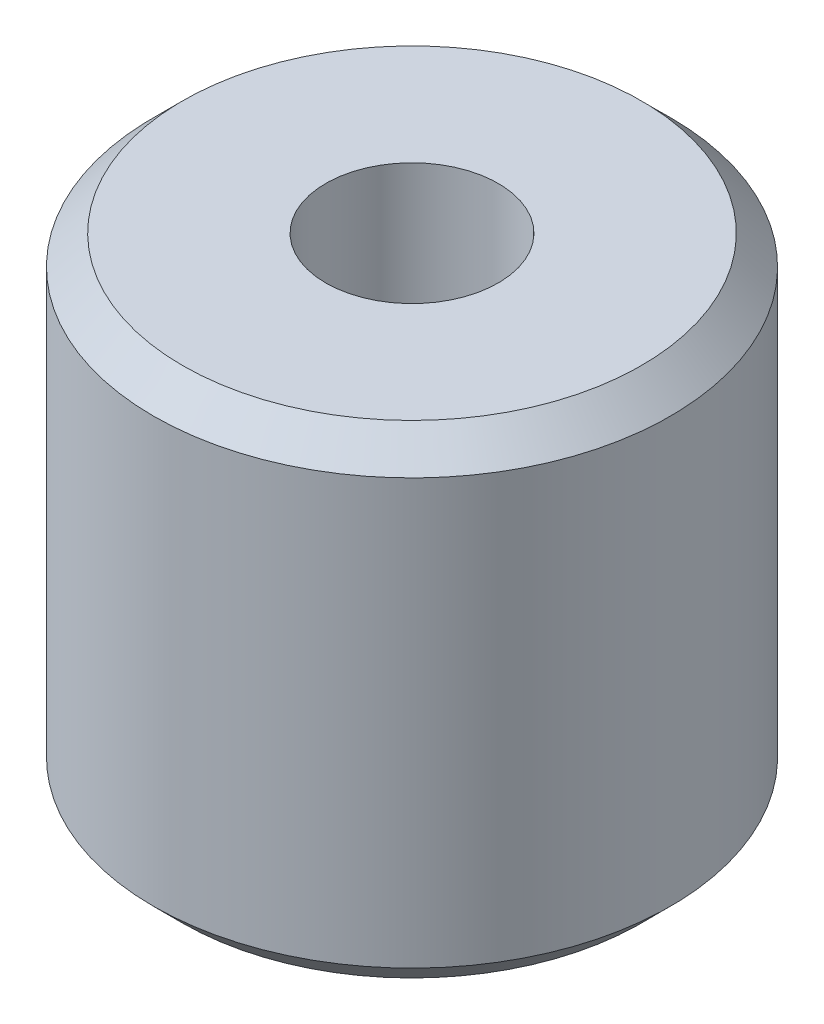
ISO-10303-21;
HEADER;
FILE_DESCRIPTION(('STEP AP214'),'2;1');
FILE_NAME('part.step','',(''),(''),'','','');
FILE_SCHEMA(('AUTOMOTIVE_DESIGN { 1 0 10303 214 1 1 1 1 }'));
ENDSEC;
DATA;
#1=APPLICATION_CONTEXT('core data for automotive mechanical design processes');
#2=APPLICATION_PROTOCOL_DEFINITION('international standard','automotive_design',2000,#1);
#3=PRODUCT_CONTEXT('',#1,'mechanical');
#4=PRODUCT('Part','Part','',(#3));
#5=PRODUCT_RELATED_PRODUCT_CATEGORY('part','',(#4));
#6=PRODUCT_DEFINITION_FORMATION('','',#4);
#7=PRODUCT_DEFINITION_CONTEXT('part definition',#1,'design');
#8=PRODUCT_DEFINITION('design','',#6,#7);
#9=PRODUCT_DEFINITION_SHAPE('','',#8);
#10=(LENGTH_UNIT() NAMED_UNIT(*) SI_UNIT(.MILLI.,.METRE.));
#11=(NAMED_UNIT(*) PLANE_ANGLE_UNIT() SI_UNIT($,.RADIAN.));
#12=(NAMED_UNIT(*) SI_UNIT($,.STERADIAN.) SOLID_ANGLE_UNIT());
#13=UNCERTAINTY_MEASURE_WITH_UNIT(LENGTH_MEASURE(1.E-05),#10,'distance_accuracy_value','');
#14=(GEOMETRIC_REPRESENTATION_CONTEXT(3) GLOBAL_UNCERTAINTY_ASSIGNED_CONTEXT((#13)) GLOBAL_UNIT_ASSIGNED_CONTEXT((#10,
#11,#12)) REPRESENTATION_CONTEXT('',''));
#15=CARTESIAN_POINT('',(0.,0.,0.));
#16=DIRECTION('',(0.,0.,1.));
#17=DIRECTION('',(1.,0.,0.));
#18=AXIS2_PLACEMENT_3D('',#15,#16,#17);
#19=CARTESIAN_POINT('',(0.,4.45,0.));
#20=DIRECTION('',(0.,1.,0.));
#21=DIRECTION('',(0.,0.,1.));
#22=AXIS2_PLACEMENT_3D('',#19,#20,#21);
#23=PLANE('',#22);
#24=CARTESIAN_POINT('',(0.,4.45,0.));
#25=DIRECTION('',(0.,1.,0.));
#26=DIRECTION('',(0.,0.,1.));
#27=AXIS2_PLACEMENT_3D('',#24,#25,#26);
#28=CIRCLE('',#27,1.59);
#29=CARTESIAN_POINT('',(0.,4.45,1.59));
#30=VERTEX_POINT('',#29);
#31=EDGE_CURVE('E59',#30,#30,#28,.T.);
#32=ORIENTED_EDGE('',*,*,#31,.F.);
#33=EDGE_LOOP('',(#32));
#34=FACE_BOUND('',#33,.T.);
#35=CARTESIAN_POINT('',(0.,4.45,0.));
#36=DIRECTION('',(0.,1.,0.));
#37=DIRECTION('',(0.,0.,1.));
#38=AXIS2_PLACEMENT_3D('',#35,#36,#37);
#39=CIRCLE('',#38,4.22759884629822);
#40=CARTESIAN_POINT('',(0.,4.45,4.22759884629822));
#41=VERTEX_POINT('',#40);
#42=EDGE_CURVE('E53',#41,#41,#39,.T.);
#43=ORIENTED_EDGE('',*,*,#42,.T.);
#44=EDGE_LOOP('',(#43));
#45=FACE_BOUND('',#44,.T.);
#46=ADVANCED_FACE('F39',(#34,#45),#23,.T.);
#47=CARTESIAN_POINT('',(0.,4.45,0.));
#48=DIRECTION('',(0.,-1.,0.));
#49=DIRECTION('',(0.,0.,-1.));
#50=AXIS2_PLACEMENT_3D('',#47,#48,#49);
#51=CONICAL_SURFACE('',#50,4.22759884629822,0.785398163397463);
#52=CARTESIAN_POINT('',(0.,3.91259884629823,0.));
#53=DIRECTION('',(0.,1.,0.));
#54=DIRECTION('',(0.,0.,1.));
#55=AXIS2_PLACEMENT_3D('',#52,#53,#54);
#56=CIRCLE('',#55,4.765);
#57=CARTESIAN_POINT('',(0.,3.91259884629823,4.765));
#58=VERTEX_POINT('',#57);
#59=EDGE_CURVE('E48',#58,#58,#56,.T.);
#60=ORIENTED_EDGE('',*,*,#59,.T.);
#61=EDGE_LOOP('',(#60));
#62=FACE_BOUND('',#61,.T.);
#63=ORIENTED_EDGE('',*,*,#42,.F.);
#64=EDGE_LOOP('',(#63));
#65=FACE_BOUND('',#64,.T.);
#66=ADVANCED_FACE('F82',(#62,#65),#51,.T.);
#67=CARTESIAN_POINT('',(0.,16.3834555288291,0.));
#68=DIRECTION('',(0.,1.,0.));
#69=DIRECTION('',(0.,0.,1.));
#70=AXIS2_PLACEMENT_3D('',#67,#68,#69);
#71=CYLINDRICAL_SURFACE('',#70,4.765);
#72=ORIENTED_EDGE('',*,*,#59,.F.);
#73=EDGE_LOOP('',(#72));
#74=FACE_BOUND('',#73,.T.);
#75=CARTESIAN_POINT('',(0.,-3.91259884629823,0.));
#76=DIRECTION('',(0.,1.,0.));
#77=DIRECTION('',(0.,0.,1.));
#78=AXIS2_PLACEMENT_3D('',#75,#76,#77);
#79=CIRCLE('',#78,4.765);
#80=CARTESIAN_POINT('',(0.,-3.91259884629823,4.765));
#81=VERTEX_POINT('',#80);
#82=EDGE_CURVE('E10',#81,#81,#79,.T.);
#83=ORIENTED_EDGE('',*,*,#82,.T.);
#84=EDGE_LOOP('',(#83));
#85=FACE_BOUND('',#84,.T.);
#86=ADVANCED_FACE('F75',(#74,#85),#71,.T.);
#87=CARTESIAN_POINT('',(0.,-4.45,0.));
#88=DIRECTION('',(0.,1.,0.));
#89=DIRECTION('',(0.,0.,1.));
#90=AXIS2_PLACEMENT_3D('',#87,#88,#89);
#91=PLANE('',#90);
#92=CARTESIAN_POINT('',(0.,-4.45,0.));
#93=DIRECTION('',(0.,1.,0.));
#94=DIRECTION('',(0.,0.,1.));
#95=AXIS2_PLACEMENT_3D('',#92,#93,#94);
#96=CIRCLE('',#95,1.59);
#97=CARTESIAN_POINT('',(0.,-4.45,1.59));
#98=VERTEX_POINT('',#97);
#99=EDGE_CURVE('E63',#98,#98,#96,.T.);
#100=ORIENTED_EDGE('',*,*,#99,.T.);
#101=EDGE_LOOP('',(#100));
#102=FACE_BOUND('',#101,.T.);
#103=CARTESIAN_POINT('',(0.,-4.45,0.));
#104=DIRECTION('',(0.,1.,0.));
#105=DIRECTION('',(0.,0.,1.));
#106=AXIS2_PLACEMENT_3D('',#103,#104,#105);
#107=CIRCLE('',#106,4.22759884629821);
#108=CARTESIAN_POINT('',(0.,-4.45,4.22759884629821));
#109=VERTEX_POINT('',#108);
#110=EDGE_CURVE('E43',#109,#109,#107,.T.);
#111=ORIENTED_EDGE('',*,*,#110,.F.);
#112=EDGE_LOOP('',(#111));
#113=FACE_BOUND('',#112,.T.);
#114=ADVANCED_FACE('F41',(#102,#113),#91,.F.);
#115=CARTESIAN_POINT('',(0.,-4.45,0.));
#116=DIRECTION('',(0.,1.,0.));
#117=DIRECTION('',(0.,0.,1.));
#118=AXIS2_PLACEMENT_3D('',#115,#116,#117);
#119=CONICAL_SURFACE('',#118,4.22759884629821,0.785398163397465);
#120=ORIENTED_EDGE('',*,*,#82,.F.);
#121=EDGE_LOOP('',(#120));
#122=FACE_BOUND('',#121,.T.);
#123=ORIENTED_EDGE('',*,*,#110,.T.);
#124=EDGE_LOOP('',(#123));
#125=FACE_BOUND('',#124,.T.);
#126=ADVANCED_FACE('F72',(#122,#125),#119,.T.);
#127=CARTESIAN_POINT('',(0.,-4.45,0.));
#128=DIRECTION('',(0.,1.,0.));
#129=DIRECTION('',(0.,0.,1.));
#130=AXIS2_PLACEMENT_3D('',#127,#128,#129);
#131=CYLINDRICAL_SURFACE('',#130,1.59);
#132=ORIENTED_EDGE('',*,*,#99,.F.);
#133=EDGE_LOOP('',(#132));
#134=FACE_BOUND('',#133,.T.);
#135=ORIENTED_EDGE('',*,*,#31,.T.);
#136=EDGE_LOOP('',(#135));
#137=FACE_BOUND('',#136,.T.);
#138=ADVANCED_FACE('F80',(#134,#137),#131,.F.);
#139=CLOSED_SHELL('',(#46,#66,#86,#114,#126,#138));
#140=MANIFOLD_SOLID_BREP('B2',#139);
#141=ADVANCED_BREP_SHAPE_REPRESENTATION('',(#18,#140),#14);
#142=SHAPE_DEFINITION_REPRESENTATION(#9,#141);
ENDSEC;
END-ISO-10303-21;
